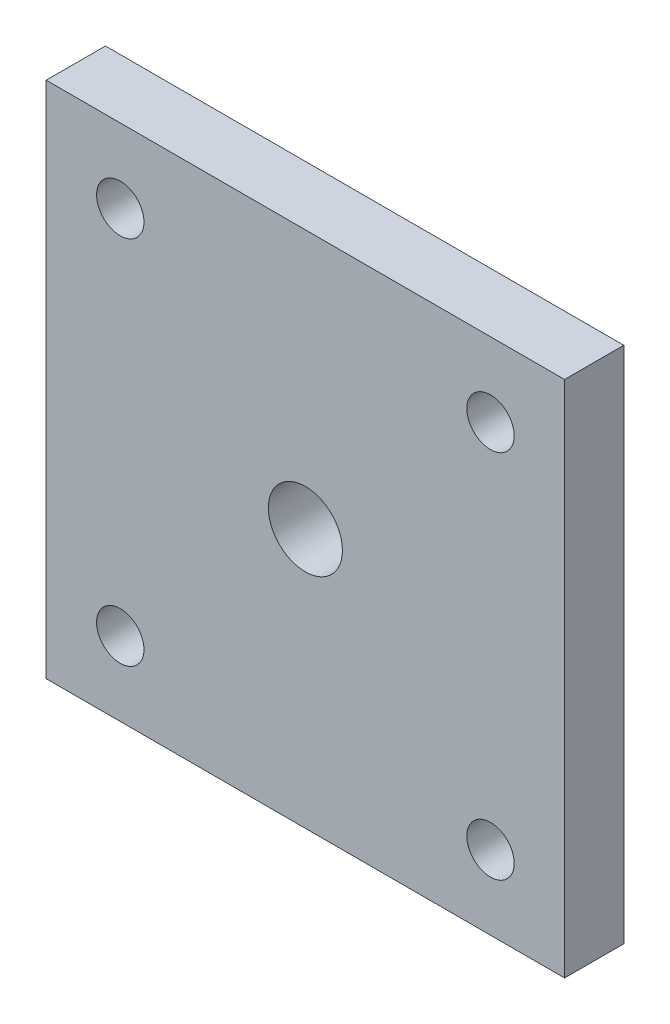
ISO-10303-21;
HEADER;
FILE_DESCRIPTION(('STEP AP214'),'2;1');
FILE_NAME('part.step','',(''),(''),'','','');
FILE_SCHEMA(('AUTOMOTIVE_DESIGN { 1 0 10303 214 1 1 1 1 }'));
ENDSEC;
DATA;
#1=APPLICATION_CONTEXT('core data for automotive mechanical design processes');
#2=APPLICATION_PROTOCOL_DEFINITION('international standard','automotive_design',2000,#1);
#3=PRODUCT_CONTEXT('',#1,'mechanical');
#4=PRODUCT('Part','Part','',(#3));
#5=PRODUCT_RELATED_PRODUCT_CATEGORY('part','',(#4));
#6=PRODUCT_DEFINITION_FORMATION('','',#4);
#7=PRODUCT_DEFINITION_CONTEXT('part definition',#1,'design');
#8=PRODUCT_DEFINITION('design','',#6,#7);
#9=PRODUCT_DEFINITION_SHAPE('','',#8);
#10=(LENGTH_UNIT() NAMED_UNIT(*) SI_UNIT(.MILLI.,.METRE.));
#11=(NAMED_UNIT(*) PLANE_ANGLE_UNIT() SI_UNIT($,.RADIAN.));
#12=(NAMED_UNIT(*) SI_UNIT($,.STERADIAN.) SOLID_ANGLE_UNIT());
#13=UNCERTAINTY_MEASURE_WITH_UNIT(LENGTH_MEASURE(1.E-05),#10,'distance_accuracy_value','');
#14=(GEOMETRIC_REPRESENTATION_CONTEXT(3) GLOBAL_UNCERTAINTY_ASSIGNED_CONTEXT((#13)) GLOBAL_UNIT_ASSIGNED_CONTEXT((#10,
#11,#12)) REPRESENTATION_CONTEXT('',''));
#15=CARTESIAN_POINT('',(0.,0.,0.));
#16=DIRECTION('',(0.,0.,1.));
#17=DIRECTION('',(1.,0.,0.));
#18=AXIS2_PLACEMENT_3D('',#15,#16,#17);
#19=CARTESIAN_POINT('',(-17.5,17.5,4.));
#20=DIRECTION('',(1.,0.,0.));
#21=DIRECTION('',(0.,0.,-1.));
#22=AXIS2_PLACEMENT_3D('',#19,#20,#21);
#23=PLANE('',#22);
#24=DIRECTION('',(0.,-1.,0.));
#25=VECTOR('',#24,1.);
#26=CARTESIAN_POINT('',(-17.5,17.5,0.));
#27=LINE('',#26,#25);
#28=CARTESIAN_POINT('',(-17.5,17.5,0.));
#29=VERTEX_POINT('',#28);
#30=CARTESIAN_POINT('',(-17.5,-17.5,0.));
#31=VERTEX_POINT('',#30);
#32=EDGE_CURVE('E113',#29,#31,#27,.T.);
#33=ORIENTED_EDGE('',*,*,#32,.T.);
#34=DIRECTION('',(0.,0.,-1.));
#35=VECTOR('',#34,1.);
#36=CARTESIAN_POINT('',(-17.5,-17.5,4.));
#37=LINE('',#36,#35);
#38=CARTESIAN_POINT('',(-17.5,-17.5,4.));
#39=VERTEX_POINT('',#38);
#40=EDGE_CURVE('E11',#39,#31,#37,.T.);
#41=ORIENTED_EDGE('',*,*,#40,.F.);
#42=DIRECTION('',(0.,-1.,0.));
#43=VECTOR('',#42,1.);
#44=CARTESIAN_POINT('',(-17.5,17.5,4.));
#45=LINE('',#44,#43);
#46=CARTESIAN_POINT('',(-17.5,17.5,4.));
#47=VERTEX_POINT('',#46);
#48=EDGE_CURVE('E97',#47,#39,#45,.T.);
#49=ORIENTED_EDGE('',*,*,#48,.F.);
#50=DIRECTION('',(0.,0.,-1.));
#51=VECTOR('',#50,1.);
#52=CARTESIAN_POINT('',(-17.5,17.5,4.));
#53=LINE('',#52,#51);
#54=EDGE_CURVE('E109',#47,#29,#53,.T.);
#55=ORIENTED_EDGE('',*,*,#54,.T.);
#56=EDGE_LOOP('',(#33,#41,#49,#55));
#57=FACE_BOUND('',#56,.T.);
#58=ADVANCED_FACE('F45',(#57),#23,.F.);
#59=CARTESIAN_POINT('',(17.5,-17.5,4.));
#60=DIRECTION('',(0.,1.,0.));
#61=DIRECTION('',(-1.,0.,0.));
#62=AXIS2_PLACEMENT_3D('',#59,#60,#61);
#63=PLANE('',#62);
#64=DIRECTION('',(1.,0.,0.));
#65=VECTOR('',#64,1.);
#66=CARTESIAN_POINT('',(17.5,-17.5,0.));
#67=LINE('',#66,#65);
#68=CARTESIAN_POINT('',(17.5,-17.5,0.));
#69=VERTEX_POINT('',#68);
#70=EDGE_CURVE('E102',#31,#69,#67,.T.);
#71=ORIENTED_EDGE('',*,*,#70,.T.);
#72=DIRECTION('',(0.,0.,-1.));
#73=VECTOR('',#72,1.);
#74=CARTESIAN_POINT('',(17.5,-17.5,4.));
#75=LINE('',#74,#73);
#76=CARTESIAN_POINT('',(17.5,-17.5,4.));
#77=VERTEX_POINT('',#76);
#78=EDGE_CURVE('E54',#77,#69,#75,.T.);
#79=ORIENTED_EDGE('',*,*,#78,.F.);
#80=DIRECTION('',(1.,0.,0.));
#81=VECTOR('',#80,1.);
#82=CARTESIAN_POINT('',(17.5,-17.5,4.));
#83=LINE('',#82,#81);
#84=EDGE_CURVE('E92',#39,#77,#83,.T.);
#85=ORIENTED_EDGE('',*,*,#84,.F.);
#86=ORIENTED_EDGE('',*,*,#40,.T.);
#87=EDGE_LOOP('',(#71,#79,#85,#86));
#88=FACE_BOUND('',#87,.T.);
#89=ADVANCED_FACE('F101',(#88),#63,.F.);
#90=CARTESIAN_POINT('',(17.5,17.5,4.));
#91=DIRECTION('',(-1.,0.,0.));
#92=DIRECTION('',(0.,0.,1.));
#93=AXIS2_PLACEMENT_3D('',#90,#91,#92);
#94=PLANE('',#93);
#95=DIRECTION('',(0.,1.,0.));
#96=VECTOR('',#95,1.);
#97=CARTESIAN_POINT('',(17.5,17.5,0.));
#98=LINE('',#97,#96);
#99=CARTESIAN_POINT('',(17.5,17.5,0.));
#100=VERTEX_POINT('',#99);
#101=EDGE_CURVE('E79',#69,#100,#98,.T.);
#102=ORIENTED_EDGE('',*,*,#101,.T.);
#103=DIRECTION('',(0.,0.,-1.));
#104=VECTOR('',#103,1.);
#105=CARTESIAN_POINT('',(17.5,17.5,4.));
#106=LINE('',#105,#104);
#107=CARTESIAN_POINT('',(17.5,17.5,4.));
#108=VERTEX_POINT('',#107);
#109=EDGE_CURVE('E104',#108,#100,#106,.T.);
#110=ORIENTED_EDGE('',*,*,#109,.F.);
#111=DIRECTION('',(0.,1.,0.));
#112=VECTOR('',#111,1.);
#113=CARTESIAN_POINT('',(17.5,17.5,4.));
#114=LINE('',#113,#112);
#115=EDGE_CURVE('E95',#77,#108,#114,.T.);
#116=ORIENTED_EDGE('',*,*,#115,.F.);
#117=ORIENTED_EDGE('',*,*,#78,.T.);
#118=EDGE_LOOP('',(#102,#110,#116,#117));
#119=FACE_BOUND('',#118,.T.);
#120=ADVANCED_FACE('F105',(#119),#94,.F.);
#121=CARTESIAN_POINT('',(17.5,17.5,4.));
#122=DIRECTION('',(0.,-1.,0.));
#123=DIRECTION('',(1.,0.,0.));
#124=AXIS2_PLACEMENT_3D('',#121,#122,#123);
#125=PLANE('',#124);
#126=DIRECTION('',(-1.,0.,0.));
#127=VECTOR('',#126,1.);
#128=CARTESIAN_POINT('',(17.5,17.5,0.));
#129=LINE('',#128,#127);
#130=EDGE_CURVE('E85',#100,#29,#129,.T.);
#131=ORIENTED_EDGE('',*,*,#130,.T.);
#132=ORIENTED_EDGE('',*,*,#54,.F.);
#133=DIRECTION('',(-1.,0.,0.));
#134=VECTOR('',#133,1.);
#135=CARTESIAN_POINT('',(17.5,17.5,4.));
#136=LINE('',#135,#134);
#137=EDGE_CURVE('E62',#108,#47,#136,.T.);
#138=ORIENTED_EDGE('',*,*,#137,.F.);
#139=ORIENTED_EDGE('',*,*,#109,.T.);
#140=EDGE_LOOP('',(#131,#132,#138,#139));
#141=FACE_BOUND('',#140,.T.);
#142=ADVANCED_FACE('F127',(#141),#125,.F.);
#143=CARTESIAN_POINT('',(0.,0.,4.));
#144=DIRECTION('',(0.,0.,-1.));
#145=DIRECTION('',(-1.,0.,0.));
#146=AXIS2_PLACEMENT_3D('',#143,#144,#145);
#147=PLANE('',#146);
#148=CARTESIAN_POINT('',(0.,0.,4.));
#149=DIRECTION('',(0.,0.,1.));
#150=DIRECTION('',(1.,0.,0.));
#151=AXIS2_PLACEMENT_3D('',#148,#149,#150);
#152=CIRCLE('',#151,2.5);
#153=CARTESIAN_POINT('',(2.5,0.,4.));
#154=VERTEX_POINT('',#153);
#155=EDGE_CURVE('E166',#154,#154,#152,.T.);
#156=ORIENTED_EDGE('',*,*,#155,.F.);
#157=EDGE_LOOP('',(#156));
#158=FACE_BOUND('',#157,.T.);
#159=CARTESIAN_POINT('',(-12.5,-12.5,4.));
#160=DIRECTION('',(0.,0.,1.));
#161=DIRECTION('',(1.,0.,0.));
#162=AXIS2_PLACEMENT_3D('',#159,#160,#161);
#163=CIRCLE('',#162,1.6);
#164=CARTESIAN_POINT('',(-10.9,-12.5,4.));
#165=VERTEX_POINT('',#164);
#166=EDGE_CURVE('E146',#165,#165,#163,.T.);
#167=ORIENTED_EDGE('',*,*,#166,.F.);
#168=EDGE_LOOP('',(#167));
#169=FACE_BOUND('',#168,.T.);
#170=CARTESIAN_POINT('',(12.5,-12.5,4.));
#171=DIRECTION('',(0.,0.,1.));
#172=DIRECTION('',(1.,0.,0.));
#173=AXIS2_PLACEMENT_3D('',#170,#171,#172);
#174=CIRCLE('',#173,1.6);
#175=CARTESIAN_POINT('',(14.1,-12.5,4.));
#176=VERTEX_POINT('',#175);
#177=EDGE_CURVE('E155',#176,#176,#174,.T.);
#178=ORIENTED_EDGE('',*,*,#177,.F.);
#179=EDGE_LOOP('',(#178));
#180=FACE_BOUND('',#179,.T.);
#181=CARTESIAN_POINT('',(12.5,12.5,4.));
#182=DIRECTION('',(0.,0.,1.));
#183=DIRECTION('',(1.,0.,0.));
#184=AXIS2_PLACEMENT_3D('',#181,#182,#183);
#185=CIRCLE('',#184,1.6);
#186=CARTESIAN_POINT('',(14.1,12.5,4.));
#187=VERTEX_POINT('',#186);
#188=EDGE_CURVE('E138',#187,#187,#185,.T.);
#189=ORIENTED_EDGE('',*,*,#188,.F.);
#190=EDGE_LOOP('',(#189));
#191=FACE_BOUND('',#190,.T.);
#192=CARTESIAN_POINT('',(-12.5,12.5,4.));
#193=DIRECTION('',(0.,0.,1.));
#194=DIRECTION('',(1.,0.,0.));
#195=AXIS2_PLACEMENT_3D('',#192,#193,#194);
#196=CIRCLE('',#195,1.6);
#197=CARTESIAN_POINT('',(-10.9,12.5,4.));
#198=VERTEX_POINT('',#197);
#199=EDGE_CURVE('E134',#198,#198,#196,.T.);
#200=ORIENTED_EDGE('',*,*,#199,.F.);
#201=EDGE_LOOP('',(#200));
#202=FACE_BOUND('',#201,.T.);
#203=ORIENTED_EDGE('',*,*,#48,.T.);
#204=ORIENTED_EDGE('',*,*,#84,.T.);
#205=ORIENTED_EDGE('',*,*,#115,.T.);
#206=ORIENTED_EDGE('',*,*,#137,.T.);
#207=EDGE_LOOP('',(#203,#204,#205,#206));
#208=FACE_BOUND('',#207,.T.);
#209=ADVANCED_FACE('F93',(#158,#169,#180,#191,#202,#208),#147,.F.);
#210=CARTESIAN_POINT('',(0.,0.,0.));
#211=DIRECTION('',(0.,0.,-1.));
#212=DIRECTION('',(-1.,0.,0.));
#213=AXIS2_PLACEMENT_3D('',#210,#211,#212);
#214=PLANE('',#213);
#215=CARTESIAN_POINT('',(0.,0.,0.));
#216=DIRECTION('',(0.,0.,1.));
#217=DIRECTION('',(1.,0.,0.));
#218=AXIS2_PLACEMENT_3D('',#215,#216,#217);
#219=CIRCLE('',#218,2.5);
#220=CARTESIAN_POINT('',(2.5,0.,0.));
#221=VERTEX_POINT('',#220);
#222=EDGE_CURVE('E147',#221,#221,#219,.T.);
#223=ORIENTED_EDGE('',*,*,#222,.T.);
#224=EDGE_LOOP('',(#223));
#225=FACE_BOUND('',#224,.T.);
#226=CARTESIAN_POINT('',(-12.5,-12.5,0.));
#227=DIRECTION('',(0.,0.,1.));
#228=DIRECTION('',(1.,0.,0.));
#229=AXIS2_PLACEMENT_3D('',#226,#227,#228);
#230=CIRCLE('',#229,1.6);
#231=CARTESIAN_POINT('',(-10.9,-12.5,0.));
#232=VERTEX_POINT('',#231);
#233=EDGE_CURVE('E142',#232,#232,#230,.T.);
#234=ORIENTED_EDGE('',*,*,#233,.T.);
#235=EDGE_LOOP('',(#234));
#236=FACE_BOUND('',#235,.T.);
#237=CARTESIAN_POINT('',(12.5,-12.5,0.));
#238=DIRECTION('',(0.,0.,1.));
#239=DIRECTION('',(1.,0.,0.));
#240=AXIS2_PLACEMENT_3D('',#237,#238,#239);
#241=CIRCLE('',#240,1.6);
#242=CARTESIAN_POINT('',(14.1,-12.5,0.));
#243=VERTEX_POINT('',#242);
#244=EDGE_CURVE('E151',#243,#243,#241,.T.);
#245=ORIENTED_EDGE('',*,*,#244,.T.);
#246=EDGE_LOOP('',(#245));
#247=FACE_BOUND('',#246,.T.);
#248=CARTESIAN_POINT('',(12.5,12.5,0.));
#249=DIRECTION('',(0.,0.,1.));
#250=DIRECTION('',(1.,0.,0.));
#251=AXIS2_PLACEMENT_3D('',#248,#249,#250);
#252=CIRCLE('',#251,1.6);
#253=CARTESIAN_POINT('',(14.1,12.5,0.));
#254=VERTEX_POINT('',#253);
#255=EDGE_CURVE('E159',#254,#254,#252,.T.);
#256=ORIENTED_EDGE('',*,*,#255,.T.);
#257=EDGE_LOOP('',(#256));
#258=FACE_BOUND('',#257,.T.);
#259=CARTESIAN_POINT('',(-12.5,12.5,0.));
#260=DIRECTION('',(0.,0.,1.));
#261=DIRECTION('',(1.,0.,0.));
#262=AXIS2_PLACEMENT_3D('',#259,#260,#261);
#263=CIRCLE('',#262,1.6);
#264=CARTESIAN_POINT('',(-10.9,12.5,0.));
#265=VERTEX_POINT('',#264);
#266=EDGE_CURVE('E117',#265,#265,#263,.T.);
#267=ORIENTED_EDGE('',*,*,#266,.T.);
#268=EDGE_LOOP('',(#267));
#269=FACE_BOUND('',#268,.T.);
#270=ORIENTED_EDGE('',*,*,#32,.F.);
#271=ORIENTED_EDGE('',*,*,#130,.F.);
#272=ORIENTED_EDGE('',*,*,#101,.F.);
#273=ORIENTED_EDGE('',*,*,#70,.F.);
#274=EDGE_LOOP('',(#270,#271,#272,#273));
#275=FACE_BOUND('',#274,.T.);
#276=ADVANCED_FACE('F130',(#225,#236,#247,#258,#269,#275),#214,.T.);
#277=CARTESIAN_POINT('',(-12.5,12.5,0.));
#278=DIRECTION('',(0.,0.,1.));
#279=DIRECTION('',(1.,0.,0.));
#280=AXIS2_PLACEMENT_3D('',#277,#278,#279);
#281=CYLINDRICAL_SURFACE('',#280,1.6);
#282=ORIENTED_EDGE('',*,*,#266,.F.);
#283=EDGE_LOOP('',(#282));
#284=FACE_BOUND('',#283,.T.);
#285=ORIENTED_EDGE('',*,*,#199,.T.);
#286=EDGE_LOOP('',(#285));
#287=FACE_BOUND('',#286,.T.);
#288=ADVANCED_FACE('F194',(#284,#287),#281,.F.);
#289=CARTESIAN_POINT('',(12.5,12.5,0.));
#290=DIRECTION('',(0.,0.,1.));
#291=DIRECTION('',(1.,0.,0.));
#292=AXIS2_PLACEMENT_3D('',#289,#290,#291);
#293=CYLINDRICAL_SURFACE('',#292,1.6);
#294=ORIENTED_EDGE('',*,*,#255,.F.);
#295=EDGE_LOOP('',(#294));
#296=FACE_BOUND('',#295,.T.);
#297=ORIENTED_EDGE('',*,*,#188,.T.);
#298=EDGE_LOOP('',(#297));
#299=FACE_BOUND('',#298,.T.);
#300=ADVANCED_FACE('F196',(#296,#299),#293,.F.);
#301=CARTESIAN_POINT('',(12.5,-12.5,0.));
#302=DIRECTION('',(0.,0.,1.));
#303=DIRECTION('',(1.,0.,0.));
#304=AXIS2_PLACEMENT_3D('',#301,#302,#303);
#305=CYLINDRICAL_SURFACE('',#304,1.6);
#306=ORIENTED_EDGE('',*,*,#244,.F.);
#307=EDGE_LOOP('',(#306));
#308=FACE_BOUND('',#307,.T.);
#309=ORIENTED_EDGE('',*,*,#177,.T.);
#310=EDGE_LOOP('',(#309));
#311=FACE_BOUND('',#310,.T.);
#312=ADVANCED_FACE('F203',(#308,#311),#305,.F.);
#313=CARTESIAN_POINT('',(-12.5,-12.5,0.));
#314=DIRECTION('',(0.,0.,1.));
#315=DIRECTION('',(1.,0.,0.));
#316=AXIS2_PLACEMENT_3D('',#313,#314,#315);
#317=CYLINDRICAL_SURFACE('',#316,1.6);
#318=ORIENTED_EDGE('',*,*,#233,.F.);
#319=EDGE_LOOP('',(#318));
#320=FACE_BOUND('',#319,.T.);
#321=ORIENTED_EDGE('',*,*,#166,.T.);
#322=EDGE_LOOP('',(#321));
#323=FACE_BOUND('',#322,.T.);
#324=ADVANCED_FACE('F179',(#320,#323),#317,.F.);
#325=CARTESIAN_POINT('',(0.,0.,0.));
#326=DIRECTION('',(0.,0.,1.));
#327=DIRECTION('',(1.,0.,0.));
#328=AXIS2_PLACEMENT_3D('',#325,#326,#327);
#329=CYLINDRICAL_SURFACE('',#328,2.5);
#330=ORIENTED_EDGE('',*,*,#222,.F.);
#331=EDGE_LOOP('',(#330));
#332=FACE_BOUND('',#331,.T.);
#333=ORIENTED_EDGE('',*,*,#155,.T.);
#334=EDGE_LOOP('',(#333));
#335=FACE_BOUND('',#334,.T.);
#336=ADVANCED_FACE('F176',(#332,#335),#329,.F.);
#337=CLOSED_SHELL('',(#58,#89,#120,#142,#209,#276,#288,#300,#312,#324,#336));
#338=MANIFOLD_SOLID_BREP('B2',#337);
#339=ADVANCED_BREP_SHAPE_REPRESENTATION('',(#18,#338),#14);
#340=SHAPE_DEFINITION_REPRESENTATION(#9,#339);
ENDSEC;
END-ISO-10303-21;
